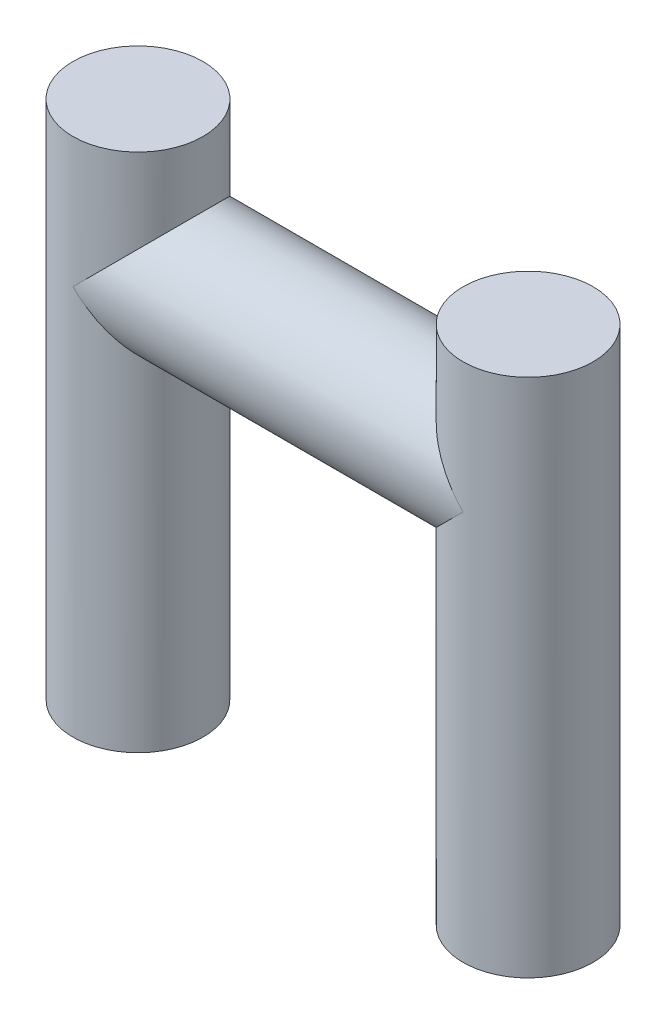
ISO-10303-21;
HEADER;
FILE_DESCRIPTION(('STEP AP214'),'2;1');
FILE_NAME('part.step','',(''),(''),'','','');
FILE_SCHEMA(('AUTOMOTIVE_DESIGN { 1 0 10303 214 1 1 1 1 }'));
ENDSEC;
DATA;
#1=APPLICATION_CONTEXT('core data for automotive mechanical design processes');
#2=APPLICATION_PROTOCOL_DEFINITION('international standard','automotive_design',2000,#1);
#3=PRODUCT_CONTEXT('',#1,'mechanical');
#4=PRODUCT('Part','Part','',(#3));
#5=PRODUCT_RELATED_PRODUCT_CATEGORY('part','',(#4));
#6=PRODUCT_DEFINITION_FORMATION('','',#4);
#7=PRODUCT_DEFINITION_CONTEXT('part definition',#1,'design');
#8=PRODUCT_DEFINITION('design','',#6,#7);
#9=PRODUCT_DEFINITION_SHAPE('','',#8);
#10=(LENGTH_UNIT() NAMED_UNIT(*) SI_UNIT(.MILLI.,.METRE.));
#11=(NAMED_UNIT(*) PLANE_ANGLE_UNIT() SI_UNIT($,.RADIAN.));
#12=(NAMED_UNIT(*) SI_UNIT($,.STERADIAN.) SOLID_ANGLE_UNIT());
#13=UNCERTAINTY_MEASURE_WITH_UNIT(LENGTH_MEASURE(1.E-05),#10,'distance_accuracy_value','');
#14=(GEOMETRIC_REPRESENTATION_CONTEXT(3) GLOBAL_UNCERTAINTY_ASSIGNED_CONTEXT((#13)) GLOBAL_UNIT_ASSIGNED_CONTEXT((#10,
#11,#12)) REPRESENTATION_CONTEXT('',''));
#15=CARTESIAN_POINT('',(0.,0.,0.));
#16=DIRECTION('',(0.,0.,1.));
#17=DIRECTION('',(1.,0.,0.));
#18=AXIS2_PLACEMENT_3D('',#15,#16,#17);
#19=CARTESIAN_POINT('',(0.,10.,0.));
#20=DIRECTION('',(0.,-1.,0.));
#21=DIRECTION('',(0.,0.,-1.));
#22=AXIS2_PLACEMENT_3D('',#19,#20,#21);
#23=CYLINDRICAL_SURFACE('',#22,2.5);
#24=CARTESIAN_POINT('',(0.,10.,0.));
#25=DIRECTION('',(0.,1.,0.));
#26=DIRECTION('',(0.,0.,1.));
#27=AXIS2_PLACEMENT_3D('',#24,#25,#26);
#28=CIRCLE('',#27,2.5);
#29=CARTESIAN_POINT('',(0.,10.,2.5));
#30=VERTEX_POINT('',#29);
#31=EDGE_CURVE('E62',#30,#30,#28,.T.);
#32=ORIENTED_EDGE('',*,*,#31,.F.);
#33=EDGE_LOOP('',(#32));
#34=FACE_BOUND('',#33,.T.);
#35=CARTESIAN_POINT('',(0.,5.,0.));
#36=DIRECTION('',(-0.707106781186547,-0.707106781186547,0.));
#37=DIRECTION('',(0.707106781186547,-0.707106781186547,0.));
#38=AXIS2_PLACEMENT_3D('',#35,#36,#37);
#39=ELLIPSE('',#38,3.53553390593274,2.5);
#40=CARTESIAN_POINT('',(0.,5.,2.5));
#41=VERTEX_POINT('',#40);
#42=CARTESIAN_POINT('',(0.,5.,-2.5));
#43=VERTEX_POINT('',#42);
#44=EDGE_CURVE('E11',#41,#43,#39,.F.);
#45=ORIENTED_EDGE('',*,*,#44,.F.);
#46=CARTESIAN_POINT('',(0.,5.,0.));
#47=DIRECTION('',(0.707106781186547,-0.707106781186547,0.));
#48=DIRECTION('',(-0.707106781186547,-0.707106781186547,0.));
#49=AXIS2_PLACEMENT_3D('',#46,#47,#48);
#50=ELLIPSE('',#49,3.53553390593274,2.5);
#51=EDGE_CURVE('E39',#43,#41,#50,.T.);
#52=ORIENTED_EDGE('',*,*,#51,.F.);
#53=EDGE_LOOP('',(#45,#52));
#54=FACE_BOUND('',#53,.T.);
#55=CARTESIAN_POINT('',(0.,-10.,0.));
#56=DIRECTION('',(0.,-1.,0.));
#57=DIRECTION('',(0.,0.,-1.));
#58=AXIS2_PLACEMENT_3D('',#55,#56,#57);
#59=CIRCLE('',#58,2.5);
#60=CARTESIAN_POINT('',(0.,-10.,-2.5));
#61=VERTEX_POINT('',#60);
#62=EDGE_CURVE('E87',#61,#61,#59,.T.);
#63=ORIENTED_EDGE('',*,*,#62,.F.);
#64=EDGE_LOOP('',(#63));
#65=FACE_BOUND('',#64,.T.);
#66=ADVANCED_FACE('F32',(#34,#54,#65),#23,.T.);
#67=CARTESIAN_POINT('',(0.,10.,0.));
#68=DIRECTION('',(0.,1.,0.));
#69=DIRECTION('',(0.,0.,1.));
#70=AXIS2_PLACEMENT_3D('',#67,#68,#69);
#71=PLANE('',#70);
#72=ORIENTED_EDGE('',*,*,#31,.T.);
#73=EDGE_LOOP('',(#72));
#74=FACE_BOUND('',#73,.T.);
#75=ADVANCED_FACE('F69',(#74),#71,.T.);
#76=CARTESIAN_POINT('',(7.5,5.,0.));
#77=DIRECTION('',(-1.,0.,0.));
#78=DIRECTION('',(0.,0.,1.));
#79=AXIS2_PLACEMENT_3D('',#76,#77,#78);
#80=CYLINDRICAL_SURFACE('',#79,2.5);
#81=ORIENTED_EDGE('',*,*,#51,.T.);
#82=ORIENTED_EDGE('',*,*,#44,.T.);
#83=EDGE_LOOP('',(#81,#82));
#84=FACE_BOUND('',#83,.T.);
#85=CARTESIAN_POINT('',(15.,5.,0.));
#86=DIRECTION('',(0.707106781186547,0.707106781186547,0.));
#87=DIRECTION('',(0.707106781186547,-0.707106781186547,0.));
#88=AXIS2_PLACEMENT_3D('',#85,#86,#87);
#89=ELLIPSE('',#88,3.53553390593274,2.5);
#90=CARTESIAN_POINT('',(15.,5.,-2.5));
#91=VERTEX_POINT('',#90);
#92=CARTESIAN_POINT('',(15.,5.,2.5));
#93=VERTEX_POINT('',#92);
#94=EDGE_CURVE('E53',#91,#93,#89,.T.);
#95=ORIENTED_EDGE('',*,*,#94,.F.);
#96=CARTESIAN_POINT('',(15.,5.,0.));
#97=DIRECTION('',(-0.707106781186547,0.707106781186547,0.));
#98=DIRECTION('',(-0.707106781186547,-0.707106781186547,0.));
#99=AXIS2_PLACEMENT_3D('',#96,#97,#98);
#100=ELLIPSE('',#99,3.53553390593274,2.5);
#101=EDGE_CURVE('E57',#93,#91,#100,.F.);
#102=ORIENTED_EDGE('',*,*,#101,.F.);
#103=EDGE_LOOP('',(#95,#102));
#104=FACE_BOUND('',#103,.T.);
#105=ADVANCED_FACE('F61',(#84,#104),#80,.T.);
#106=CARTESIAN_POINT('',(15.,10.,0.));
#107=DIRECTION('',(0.,-1.,0.));
#108=DIRECTION('',(0.,0.,-1.));
#109=AXIS2_PLACEMENT_3D('',#106,#107,#108);
#110=CYLINDRICAL_SURFACE('',#109,2.5);
#111=CARTESIAN_POINT('',(15.,10.,0.));
#112=DIRECTION('',(0.,-1.,0.));
#113=DIRECTION('',(0.,0.,1.));
#114=AXIS2_PLACEMENT_3D('',#111,#112,#113);
#115=CIRCLE('',#114,2.5);
#116=CARTESIAN_POINT('',(15.,10.,2.5));
#117=VERTEX_POINT('',#116);
#118=EDGE_CURVE('E59',#117,#117,#115,.T.);
#119=ORIENTED_EDGE('',*,*,#118,.T.);
#120=EDGE_LOOP('',(#119));
#121=FACE_BOUND('',#120,.T.);
#122=ORIENTED_EDGE('',*,*,#101,.T.);
#123=ORIENTED_EDGE('',*,*,#94,.T.);
#124=EDGE_LOOP('',(#122,#123));
#125=FACE_BOUND('',#124,.T.);
#126=CARTESIAN_POINT('',(15.,-10.,0.));
#127=DIRECTION('',(0.,-1.,0.));
#128=DIRECTION('',(0.,0.,-1.));
#129=AXIS2_PLACEMENT_3D('',#126,#127,#128);
#130=CIRCLE('',#129,2.5);
#131=CARTESIAN_POINT('',(15.,-10.,-2.5));
#132=VERTEX_POINT('',#131);
#133=EDGE_CURVE('E89',#132,#132,#130,.T.);
#134=ORIENTED_EDGE('',*,*,#133,.F.);
#135=EDGE_LOOP('',(#134));
#136=FACE_BOUND('',#135,.T.);
#137=ADVANCED_FACE('F55',(#121,#125,#136),#110,.T.);
#138=CARTESIAN_POINT('',(15.,10.,0.));
#139=DIRECTION('',(0.,1.,0.));
#140=DIRECTION('',(0.,0.,1.));
#141=AXIS2_PLACEMENT_3D('',#138,#139,#140);
#142=PLANE('',#141);
#143=ORIENTED_EDGE('',*,*,#118,.F.);
#144=EDGE_LOOP('',(#143));
#145=FACE_BOUND('',#144,.T.);
#146=ADVANCED_FACE('F75',(#145),#142,.T.);
#147=CARTESIAN_POINT('',(0.,-10.,0.));
#148=DIRECTION('',(0.,-1.,0.));
#149=DIRECTION('',(0.,0.,-1.));
#150=AXIS2_PLACEMENT_3D('',#147,#148,#149);
#151=PLANE('',#150);
#152=ORIENTED_EDGE('',*,*,#62,.T.);
#153=EDGE_LOOP('',(#152));
#154=FACE_BOUND('',#153,.T.);
#155=ADVANCED_FACE('F98',(#154),#151,.T.);
#156=CARTESIAN_POINT('',(15.,-10.,0.));
#157=DIRECTION('',(0.,-1.,0.));
#158=DIRECTION('',(0.,0.,-1.));
#159=AXIS2_PLACEMENT_3D('',#156,#157,#158);
#160=PLANE('',#159);
#161=ORIENTED_EDGE('',*,*,#133,.T.);
#162=EDGE_LOOP('',(#161));
#163=FACE_BOUND('',#162,.T.);
#164=ADVANCED_FACE('F96',(#163),#160,.T.);
#165=CLOSED_SHELL('',(#66,#75,#105,#137,#146,#155,#164));
#166=MANIFOLD_SOLID_BREP('B2',#165);
#167=ADVANCED_BREP_SHAPE_REPRESENTATION('',(#18,#166),#14);
#168=SHAPE_DEFINITION_REPRESENTATION(#9,#167);
ENDSEC;
END-ISO-10303-21;
